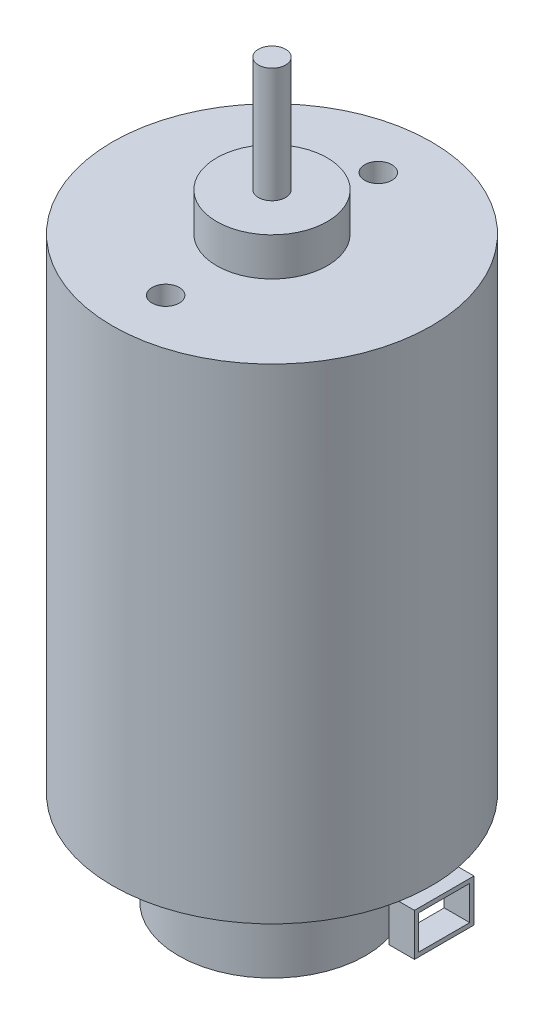
ISO-10303-21;
HEADER;
FILE_DESCRIPTION(('STEP AP214'),'2;1');
FILE_NAME('part.step','',(''),(''),'','','');
FILE_SCHEMA(('AUTOMOTIVE_DESIGN { 1 0 10303 214 1 1 1 1 }'));
ENDSEC;
DATA;
#1=APPLICATION_CONTEXT('core data for automotive mechanical design processes');
#2=APPLICATION_PROTOCOL_DEFINITION('international standard','automotive_design',2000,#1);
#3=PRODUCT_CONTEXT('',#1,'mechanical');
#4=PRODUCT('Part','Part','',(#3));
#5=PRODUCT_RELATED_PRODUCT_CATEGORY('part','',(#4));
#6=PRODUCT_DEFINITION_FORMATION('','',#4);
#7=PRODUCT_DEFINITION_CONTEXT('part definition',#1,'design');
#8=PRODUCT_DEFINITION('design','',#6,#7);
#9=PRODUCT_DEFINITION_SHAPE('','',#8);
#10=(LENGTH_UNIT() NAMED_UNIT(*) SI_UNIT(.MILLI.,.METRE.));
#11=(NAMED_UNIT(*) PLANE_ANGLE_UNIT() SI_UNIT($,.RADIAN.));
#12=(NAMED_UNIT(*) SI_UNIT($,.STERADIAN.) SOLID_ANGLE_UNIT());
#13=UNCERTAINTY_MEASURE_WITH_UNIT(LENGTH_MEASURE(1.E-05),#10,'distance_accuracy_value','');
#14=(GEOMETRIC_REPRESENTATION_CONTEXT(3) GLOBAL_UNCERTAINTY_ASSIGNED_CONTEXT((#13)) GLOBAL_UNIT_ASSIGNED_CONTEXT((#10,
#11,#12)) REPRESENTATION_CONTEXT('',''));
#15=CARTESIAN_POINT('',(0.,0.,0.));
#16=DIRECTION('',(0.,0.,1.));
#17=DIRECTION('',(1.,0.,0.));
#18=AXIS2_PLACEMENT_3D('',#15,#16,#17);
#19=CARTESIAN_POINT('',(0.,0.,0.));
#20=DIRECTION('',(0.,1.,0.));
#21=DIRECTION('',(0.,0.,1.));
#22=AXIS2_PLACEMENT_3D('',#19,#20,#21);
#23=PLANE('',#22);
#24=CARTESIAN_POINT('',(0.,0.,0.));
#25=DIRECTION('',(0.,1.,0.));
#26=DIRECTION('',(0.,0.,1.));
#27=AXIS2_PLACEMENT_3D('',#24,#25,#26);
#28=CIRCLE('',#27,11.);
#29=CARTESIAN_POINT('',(0.,0.,11.));
#30=VERTEX_POINT('',#29);
#31=EDGE_CURVE('E44',#30,#30,#28,.F.);
#32=ORIENTED_EDGE('',*,*,#31,.F.);
#33=EDGE_LOOP('',(#32));
#34=FACE_BOUND('',#33,.T.);
#35=DIRECTION('',(-1.,0.,0.));
#36=VECTOR('',#35,1.);
#37=CARTESIAN_POINT('',(0.,0.,3.5));
#38=LINE('',#37,#36);
#39=CARTESIAN_POINT('',(18.4204370197886,0.,3.5));
#40=VERTEX_POINT('',#39);
#41=CARTESIAN_POINT('',(17.25,0.,3.5));
#42=VERTEX_POINT('',#41);
#43=EDGE_CURVE('E11',#40,#42,#38,.T.);
#44=ORIENTED_EDGE('',*,*,#43,.F.);
#45=CARTESIAN_POINT('',(0.,0.,0.));
#46=DIRECTION('',(0.,1.,0.));
#47=DIRECTION('',(0.,0.,1.));
#48=AXIS2_PLACEMENT_3D('',#45,#46,#47);
#49=CIRCLE('',#48,18.75);
#50=CARTESIAN_POINT('',(18.4204370197886,0.,-3.5));
#51=VERTEX_POINT('',#50);
#52=EDGE_CURVE('E184',#51,#40,#49,.T.);
#53=ORIENTED_EDGE('',*,*,#52,.F.);
#54=DIRECTION('',(1.,0.,0.));
#55=VECTOR('',#54,1.);
#56=CARTESIAN_POINT('',(17.25,0.,-3.5));
#57=LINE('',#56,#55);
#58=CARTESIAN_POINT('',(17.25,0.,-3.5));
#59=VERTEX_POINT('',#58);
#60=EDGE_CURVE('E152',#59,#51,#57,.T.);
#61=ORIENTED_EDGE('',*,*,#60,.F.);
#62=DIRECTION('',(0.,0.,-1.));
#63=VECTOR('',#62,1.);
#64=CARTESIAN_POINT('',(17.25,0.,-3.5));
#65=LINE('',#64,#63);
#66=EDGE_CURVE('E164',#42,#59,#65,.T.);
#67=ORIENTED_EDGE('',*,*,#66,.F.);
#68=EDGE_LOOP('',(#44,#53,#61,#67));
#69=FACE_BOUND('',#68,.T.);
#70=ADVANCED_FACE('F36',(#34,#69),#23,.F.);
#71=CARTESIAN_POINT('',(0.,57.,0.));
#72=DIRECTION('',(0.,-1.,0.));
#73=DIRECTION('',(0.,0.,-1.));
#74=AXIS2_PLACEMENT_3D('',#71,#72,#73);
#75=CYLINDRICAL_SURFACE('',#74,18.75);
#76=CARTESIAN_POINT('',(0.,57.,0.));
#77=DIRECTION('',(0.,1.,0.));
#78=DIRECTION('',(0.,0.,1.));
#79=AXIS2_PLACEMENT_3D('',#76,#77,#78);
#80=CIRCLE('',#79,18.75);
#81=CARTESIAN_POINT('',(0.,57.,18.75));
#82=VERTEX_POINT('',#81);
#83=EDGE_CURVE('E185',#82,#82,#80,.T.);
#84=ORIENTED_EDGE('',*,*,#83,.F.);
#85=EDGE_LOOP('',(#84));
#86=FACE_BOUND('',#85,.T.);
#87=EDGE_CURVE('E188',#40,#51,#49,.T.);
#88=ORIENTED_EDGE('',*,*,#87,.T.);
#89=ORIENTED_EDGE('',*,*,#52,.T.);
#90=EDGE_LOOP('',(#88,#89));
#91=FACE_BOUND('',#90,.T.);
#92=ADVANCED_FACE('F38',(#86,#91),#75,.T.);
#93=CARTESIAN_POINT('',(0.,57.,0.));
#94=DIRECTION('',(0.,1.,0.));
#95=DIRECTION('',(0.,0.,1.));
#96=AXIS2_PLACEMENT_3D('',#93,#94,#95);
#97=PLANE('',#96);
#98=CARTESIAN_POINT('',(0.,57.,-12.5));
#99=DIRECTION('',(0.,1.,0.));
#100=DIRECTION('',(0.,0.,1.));
#101=AXIS2_PLACEMENT_3D('',#98,#99,#100);
#102=CIRCLE('',#101,1.6);
#103=CARTESIAN_POINT('',(0.,57.,-10.9));
#104=VERTEX_POINT('',#103);
#105=EDGE_CURVE('E254',#104,#104,#102,.T.);
#106=ORIENTED_EDGE('',*,*,#105,.F.);
#107=EDGE_LOOP('',(#106));
#108=FACE_BOUND('',#107,.T.);
#109=CARTESIAN_POINT('',(0.,57.,12.5));
#110=DIRECTION('',(0.,1.,0.));
#111=DIRECTION('',(0.,0.,1.));
#112=AXIS2_PLACEMENT_3D('',#109,#110,#111);
#113=CIRCLE('',#112,1.6);
#114=CARTESIAN_POINT('',(0.,57.,14.1));
#115=VERTEX_POINT('',#114);
#116=EDGE_CURVE('E258',#115,#115,#113,.T.);
#117=ORIENTED_EDGE('',*,*,#116,.F.);
#118=EDGE_LOOP('',(#117));
#119=FACE_BOUND('',#118,.T.);
#120=CARTESIAN_POINT('',(0.,57.,0.));
#121=DIRECTION('',(0.,1.,0.));
#122=DIRECTION('',(0.,0.,1.));
#123=AXIS2_PLACEMENT_3D('',#120,#121,#122);
#124=CIRCLE('',#123,6.5);
#125=CARTESIAN_POINT('',(0.,57.,6.5));
#126=VERTEX_POINT('',#125);
#127=EDGE_CURVE('E131',#126,#126,#124,.T.);
#128=ORIENTED_EDGE('',*,*,#127,.F.);
#129=EDGE_LOOP('',(#128));
#130=FACE_BOUND('',#129,.T.);
#131=ORIENTED_EDGE('',*,*,#83,.T.);
#132=EDGE_LOOP('',(#131));
#133=FACE_BOUND('',#132,.T.);
#134=ADVANCED_FACE('F243',(#108,#119,#130,#133),#97,.T.);
#135=CARTESIAN_POINT('',(0.,-11.,0.));
#136=DIRECTION('',(0.,1.,0.));
#137=DIRECTION('',(0.,0.,1.));
#138=AXIS2_PLACEMENT_3D('',#135,#136,#137);
#139=CYLINDRICAL_SURFACE('',#138,11.);
#140=CARTESIAN_POINT('',(0.,-11.,0.));
#141=DIRECTION('',(0.,-1.,0.));
#142=DIRECTION('',(0.,0.,-1.));
#143=AXIS2_PLACEMENT_3D('',#140,#141,#142);
#144=CIRCLE('',#143,11.);
#145=CARTESIAN_POINT('',(0.,-11.,-11.));
#146=VERTEX_POINT('',#145);
#147=EDGE_CURVE('E181',#146,#146,#144,.T.);
#148=ORIENTED_EDGE('',*,*,#147,.F.);
#149=EDGE_LOOP('',(#148));
#150=FACE_BOUND('',#149,.T.);
#151=ORIENTED_EDGE('',*,*,#31,.T.);
#152=EDGE_LOOP('',(#151));
#153=FACE_BOUND('',#152,.T.);
#154=ADVANCED_FACE('F192',(#150,#153),#139,.T.);
#155=CARTESIAN_POINT('',(0.,-11.,0.));
#156=DIRECTION('',(0.,-1.,0.));
#157=DIRECTION('',(0.,0.,-1.));
#158=AXIS2_PLACEMENT_3D('',#155,#156,#157);
#159=PLANE('',#158);
#160=ORIENTED_EDGE('',*,*,#147,.T.);
#161=EDGE_LOOP('',(#160));
#162=FACE_BOUND('',#161,.T.);
#163=ADVANCED_FACE('F236',(#162),#159,.T.);
#164=CARTESIAN_POINT('',(20.25,-5.,-3.5));
#165=DIRECTION('',(-1.,0.,0.));
#166=DIRECTION('',(0.,0.,1.));
#167=AXIS2_PLACEMENT_3D('',#164,#165,#166);
#168=PLANE('',#167);
#169=DIRECTION('',(0.,0.,-1.));
#170=VECTOR('',#169,1.);
#171=CARTESIAN_POINT('',(20.25,-4.5,-3.));
#172=LINE('',#171,#170);
#173=CARTESIAN_POINT('',(20.25,-4.5,3.));
#174=VERTEX_POINT('',#173);
#175=CARTESIAN_POINT('',(20.25,-4.5,-3.));
#176=VERTEX_POINT('',#175);
#177=EDGE_CURVE('E137',#174,#176,#172,.T.);
#178=ORIENTED_EDGE('',*,*,#177,.F.);
#179=DIRECTION('',(0.,-1.,0.));
#180=VECTOR('',#179,1.);
#181=CARTESIAN_POINT('',(20.25,-4.5,3.));
#182=LINE('',#181,#180);
#183=CARTESIAN_POINT('',(20.25,-0.5,3.));
#184=VERTEX_POINT('',#183);
#185=EDGE_CURVE('E51',#184,#174,#182,.T.);
#186=ORIENTED_EDGE('',*,*,#185,.F.);
#187=DIRECTION('',(0.,0.,1.));
#188=VECTOR('',#187,1.);
#189=CARTESIAN_POINT('',(20.25,-0.499999999999999,-3.));
#190=LINE('',#189,#188);
#191=CARTESIAN_POINT('',(20.25,-0.499999999999999,-3.));
#192=VERTEX_POINT('',#191);
#193=EDGE_CURVE('E125',#192,#184,#190,.T.);
#194=ORIENTED_EDGE('',*,*,#193,.F.);
#195=DIRECTION('',(0.,1.,0.));
#196=VECTOR('',#195,1.);
#197=CARTESIAN_POINT('',(20.25,-4.5,-3.));
#198=LINE('',#197,#196);
#199=EDGE_CURVE('E128',#176,#192,#198,.T.);
#200=ORIENTED_EDGE('',*,*,#199,.F.);
#201=EDGE_LOOP('',(#178,#186,#194,#200));
#202=FACE_BOUND('',#201,.T.);
#203=DIRECTION('',(0.,0.,1.));
#204=VECTOR('',#203,1.);
#205=CARTESIAN_POINT('',(20.25,0.,-3.5));
#206=LINE('',#205,#204);
#207=CARTESIAN_POINT('',(20.25,0.,-3.5));
#208=VERTEX_POINT('',#207);
#209=CARTESIAN_POINT('',(20.25,0.,3.5));
#210=VERTEX_POINT('',#209);
#211=EDGE_CURVE('E144',#208,#210,#206,.T.);
#212=ORIENTED_EDGE('',*,*,#211,.T.);
#213=DIRECTION('',(0.,1.,0.));
#214=VECTOR('',#213,1.);
#215=CARTESIAN_POINT('',(20.25,-5.,3.5));
#216=LINE('',#215,#214);
#217=CARTESIAN_POINT('',(20.25,-5.,3.5));
#218=VERTEX_POINT('',#217);
#219=EDGE_CURVE('E178',#218,#210,#216,.T.);
#220=ORIENTED_EDGE('',*,*,#219,.F.);
#221=DIRECTION('',(0.,0.,1.));
#222=VECTOR('',#221,1.);
#223=CARTESIAN_POINT('',(20.25,-5.,-3.5));
#224=LINE('',#223,#222);
#225=CARTESIAN_POINT('',(20.25,-5.,-3.5));
#226=VERTEX_POINT('',#225);
#227=EDGE_CURVE('E148',#226,#218,#224,.T.);
#228=ORIENTED_EDGE('',*,*,#227,.F.);
#229=DIRECTION('',(0.,1.,0.));
#230=VECTOR('',#229,1.);
#231=CARTESIAN_POINT('',(20.25,-5.,-3.5));
#232=LINE('',#231,#230);
#233=EDGE_CURVE('E158',#226,#208,#232,.T.);
#234=ORIENTED_EDGE('',*,*,#233,.T.);
#235=EDGE_LOOP('',(#212,#220,#228,#234));
#236=FACE_BOUND('',#235,.T.);
#237=ADVANCED_FACE('F210',(#202,#236),#168,.F.);
#238=CARTESIAN_POINT('',(17.25,-5.,3.5));
#239=DIRECTION('',(0.,0.,-1.));
#240=DIRECTION('',(-1.,0.,0.));
#241=AXIS2_PLACEMENT_3D('',#238,#239,#240);
#242=PLANE('',#241);
#243=DIRECTION('',(-1.,0.,0.));
#244=VECTOR('',#243,1.);
#245=CARTESIAN_POINT('',(17.25,0.,3.5));
#246=LINE('',#245,#244);
#247=EDGE_CURVE('E161',#210,#40,#246,.T.);
#248=ORIENTED_EDGE('',*,*,#247,.T.);
#249=ORIENTED_EDGE('',*,*,#43,.T.);
#250=DIRECTION('',(0.,1.,0.));
#251=VECTOR('',#250,1.);
#252=CARTESIAN_POINT('',(17.25,-5.,3.5));
#253=LINE('',#252,#251);
#254=CARTESIAN_POINT('',(17.25,-5.,3.5));
#255=VERTEX_POINT('',#254);
#256=EDGE_CURVE('E175',#255,#42,#253,.T.);
#257=ORIENTED_EDGE('',*,*,#256,.F.);
#258=DIRECTION('',(-1.,0.,0.));
#259=VECTOR('',#258,1.);
#260=CARTESIAN_POINT('',(17.25,-5.,3.5));
#261=LINE('',#260,#259);
#262=EDGE_CURVE('E151',#218,#255,#261,.T.);
#263=ORIENTED_EDGE('',*,*,#262,.F.);
#264=ORIENTED_EDGE('',*,*,#219,.T.);
#265=EDGE_LOOP('',(#248,#249,#257,#263,#264));
#266=FACE_BOUND('',#265,.T.);
#267=ADVANCED_FACE('F206',(#266),#242,.F.);
#268=CARTESIAN_POINT('',(17.25,-5.,-3.5));
#269=DIRECTION('',(1.,0.,0.));
#270=DIRECTION('',(0.,0.,-1.));
#271=AXIS2_PLACEMENT_3D('',#268,#269,#270);
#272=PLANE('',#271);
#273=DIRECTION('',(0.,0.,1.));
#274=VECTOR('',#273,1.);
#275=CARTESIAN_POINT('',(17.25,-0.499999999999999,-3.));
#276=LINE('',#275,#274);
#277=CARTESIAN_POINT('',(17.25,-0.499999999999999,-3.));
#278=VERTEX_POINT('',#277);
#279=CARTESIAN_POINT('',(17.25,-0.5,3.));
#280=VERTEX_POINT('',#279);
#281=EDGE_CURVE('E115',#278,#280,#276,.T.);
#282=ORIENTED_EDGE('',*,*,#281,.T.);
#283=DIRECTION('',(0.,-1.,0.));
#284=VECTOR('',#283,1.);
#285=CARTESIAN_POINT('',(17.25,-4.5,3.));
#286=LINE('',#285,#284);
#287=CARTESIAN_POINT('',(17.25,-4.5,3.));
#288=VERTEX_POINT('',#287);
#289=EDGE_CURVE('E109',#280,#288,#286,.T.);
#290=ORIENTED_EDGE('',*,*,#289,.T.);
#291=DIRECTION('',(0.,0.,-1.));
#292=VECTOR('',#291,1.);
#293=CARTESIAN_POINT('',(17.25,-4.5,-3.));
#294=LINE('',#293,#292);
#295=CARTESIAN_POINT('',(17.25,-4.5,-3.));
#296=VERTEX_POINT('',#295);
#297=EDGE_CURVE('E118',#288,#296,#294,.T.);
#298=ORIENTED_EDGE('',*,*,#297,.T.);
#299=DIRECTION('',(0.,1.,0.));
#300=VECTOR('',#299,1.);
#301=CARTESIAN_POINT('',(17.25,-4.5,-3.));
#302=LINE('',#301,#300);
#303=EDGE_CURVE('E59',#296,#278,#302,.T.);
#304=ORIENTED_EDGE('',*,*,#303,.T.);
#305=EDGE_LOOP('',(#282,#290,#298,#304));
#306=FACE_BOUND('',#305,.T.);
#307=ORIENTED_EDGE('',*,*,#66,.T.);
#308=DIRECTION('',(0.,1.,0.));
#309=VECTOR('',#308,1.);
#310=CARTESIAN_POINT('',(17.25,-5.,-3.5));
#311=LINE('',#310,#309);
#312=CARTESIAN_POINT('',(17.25,-5.,-3.5));
#313=VERTEX_POINT('',#312);
#314=EDGE_CURVE('E172',#313,#59,#311,.T.);
#315=ORIENTED_EDGE('',*,*,#314,.F.);
#316=DIRECTION('',(0.,0.,-1.));
#317=VECTOR('',#316,1.);
#318=CARTESIAN_POINT('',(17.25,-5.,-3.5));
#319=LINE('',#318,#317);
#320=EDGE_CURVE('E154',#255,#313,#319,.T.);
#321=ORIENTED_EDGE('',*,*,#320,.F.);
#322=ORIENTED_EDGE('',*,*,#256,.T.);
#323=EDGE_LOOP('',(#307,#315,#321,#322));
#324=FACE_BOUND('',#323,.T.);
#325=ADVANCED_FACE('F122',(#306,#324),#272,.F.);
#326=CARTESIAN_POINT('',(17.25,-5.,-3.5));
#327=DIRECTION('',(0.,0.,1.));
#328=DIRECTION('',(1.,0.,0.));
#329=AXIS2_PLACEMENT_3D('',#326,#327,#328);
#330=PLANE('',#329);
#331=ORIENTED_EDGE('',*,*,#60,.T.);
#332=EDGE_CURVE('E167',#51,#208,#57,.T.);
#333=ORIENTED_EDGE('',*,*,#332,.T.);
#334=ORIENTED_EDGE('',*,*,#233,.F.);
#335=DIRECTION('',(1.,0.,0.));
#336=VECTOR('',#335,1.);
#337=CARTESIAN_POINT('',(17.25,-5.,-3.5));
#338=LINE('',#337,#336);
#339=EDGE_CURVE('E156',#313,#226,#338,.T.);
#340=ORIENTED_EDGE('',*,*,#339,.F.);
#341=ORIENTED_EDGE('',*,*,#314,.T.);
#342=EDGE_LOOP('',(#331,#333,#334,#340,#341));
#343=FACE_BOUND('',#342,.T.);
#344=ADVANCED_FACE('F214',(#343),#330,.F.);
#345=CARTESIAN_POINT('',(0.,-5.,0.));
#346=DIRECTION('',(0.,1.,0.));
#347=DIRECTION('',(0.,0.,1.));
#348=AXIS2_PLACEMENT_3D('',#345,#346,#347);
#349=PLANE('',#348);
#350=ORIENTED_EDGE('',*,*,#227,.T.);
#351=ORIENTED_EDGE('',*,*,#262,.T.);
#352=ORIENTED_EDGE('',*,*,#320,.T.);
#353=ORIENTED_EDGE('',*,*,#339,.T.);
#354=EDGE_LOOP('',(#350,#351,#352,#353));
#355=FACE_BOUND('',#354,.T.);
#356=ADVANCED_FACE('F218',(#355),#349,.F.);
#357=CARTESIAN_POINT('',(0.,0.,0.));
#358=DIRECTION('',(0.,1.,0.));
#359=DIRECTION('',(0.,0.,1.));
#360=AXIS2_PLACEMENT_3D('',#357,#358,#359);
#361=PLANE('',#360);
#362=ORIENTED_EDGE('',*,*,#87,.F.);
#363=ORIENTED_EDGE('',*,*,#247,.F.);
#364=ORIENTED_EDGE('',*,*,#211,.F.);
#365=ORIENTED_EDGE('',*,*,#332,.F.);
#366=EDGE_LOOP('',(#362,#363,#364,#365));
#367=FACE_BOUND('',#366,.T.);
#368=ADVANCED_FACE('F204',(#367),#361,.T.);
#369=CARTESIAN_POINT('',(17.25,-4.5,3.));
#370=DIRECTION('',(0.,0.,1.));
#371=DIRECTION('',(1.,0.,0.));
#372=AXIS2_PLACEMENT_3D('',#369,#370,#371);
#373=PLANE('',#372);
#374=ORIENTED_EDGE('',*,*,#185,.T.);
#375=DIRECTION('',(1.,0.,0.));
#376=VECTOR('',#375,1.);
#377=CARTESIAN_POINT('',(17.25,-4.5,3.));
#378=LINE('',#377,#376);
#379=EDGE_CURVE('E105',#288,#174,#378,.T.);
#380=ORIENTED_EDGE('',*,*,#379,.F.);
#381=ORIENTED_EDGE('',*,*,#289,.F.);
#382=DIRECTION('',(1.,0.,0.));
#383=VECTOR('',#382,1.);
#384=CARTESIAN_POINT('',(17.25,-0.5,3.));
#385=LINE('',#384,#383);
#386=EDGE_CURVE('E142',#280,#184,#385,.T.);
#387=ORIENTED_EDGE('',*,*,#386,.T.);
#388=EDGE_LOOP('',(#374,#380,#381,#387));
#389=FACE_BOUND('',#388,.T.);
#390=ADVANCED_FACE('F107',(#389),#373,.F.);
#391=CARTESIAN_POINT('',(17.25,-0.499999999999999,-3.));
#392=DIRECTION('',(0.,1.,0.));
#393=DIRECTION('',(0.,0.,1.));
#394=AXIS2_PLACEMENT_3D('',#391,#392,#393);
#395=PLANE('',#394);
#396=ORIENTED_EDGE('',*,*,#193,.T.);
#397=ORIENTED_EDGE('',*,*,#386,.F.);
#398=ORIENTED_EDGE('',*,*,#281,.F.);
#399=DIRECTION('',(1.,0.,0.));
#400=VECTOR('',#399,1.);
#401=CARTESIAN_POINT('',(17.25,-0.499999999999999,-3.));
#402=LINE('',#401,#400);
#403=EDGE_CURVE('E145',#278,#192,#402,.T.);
#404=ORIENTED_EDGE('',*,*,#403,.T.);
#405=EDGE_LOOP('',(#396,#397,#398,#404));
#406=FACE_BOUND('',#405,.T.);
#407=ADVANCED_FACE('F308',(#406),#395,.F.);
#408=CARTESIAN_POINT('',(17.25,-4.5,-3.));
#409=DIRECTION('',(0.,0.,-1.));
#410=DIRECTION('',(-1.,0.,0.));
#411=AXIS2_PLACEMENT_3D('',#408,#409,#410);
#412=PLANE('',#411);
#413=ORIENTED_EDGE('',*,*,#199,.T.);
#414=ORIENTED_EDGE('',*,*,#403,.F.);
#415=ORIENTED_EDGE('',*,*,#303,.F.);
#416=DIRECTION('',(1.,0.,0.));
#417=VECTOR('',#416,1.);
#418=CARTESIAN_POINT('',(17.25,-4.5,-3.));
#419=LINE('',#418,#417);
#420=EDGE_CURVE('E114',#296,#176,#419,.T.);
#421=ORIENTED_EDGE('',*,*,#420,.T.);
#422=EDGE_LOOP('',(#413,#414,#415,#421));
#423=FACE_BOUND('',#422,.T.);
#424=ADVANCED_FACE('F305',(#423),#412,.F.);
#425=CARTESIAN_POINT('',(17.25,-4.5,-3.));
#426=DIRECTION('',(0.,-1.,0.));
#427=DIRECTION('',(0.,0.,-1.));
#428=AXIS2_PLACEMENT_3D('',#425,#426,#427);
#429=PLANE('',#428);
#430=ORIENTED_EDGE('',*,*,#177,.T.);
#431=ORIENTED_EDGE('',*,*,#420,.F.);
#432=ORIENTED_EDGE('',*,*,#297,.F.);
#433=ORIENTED_EDGE('',*,*,#379,.T.);
#434=EDGE_LOOP('',(#430,#431,#432,#433));
#435=FACE_BOUND('',#434,.T.);
#436=ADVANCED_FACE('F119',(#435),#429,.F.);
#437=CARTESIAN_POINT('',(0.,61.5,0.));
#438=DIRECTION('',(0.,-1.,0.));
#439=DIRECTION('',(0.,0.,-1.));
#440=AXIS2_PLACEMENT_3D('',#437,#438,#439);
#441=CYLINDRICAL_SURFACE('',#440,6.5);
#442=CARTESIAN_POINT('',(0.,61.5,0.));
#443=DIRECTION('',(0.,1.,0.));
#444=DIRECTION('',(0.,0.,1.));
#445=AXIS2_PLACEMENT_3D('',#442,#443,#444);
#446=CIRCLE('',#445,6.5);
#447=CARTESIAN_POINT('',(0.,61.5,6.5));
#448=VERTEX_POINT('',#447);
#449=EDGE_CURVE('E138',#448,#448,#446,.T.);
#450=ORIENTED_EDGE('',*,*,#449,.F.);
#451=EDGE_LOOP('',(#450));
#452=FACE_BOUND('',#451,.T.);
#453=ORIENTED_EDGE('',*,*,#127,.T.);
#454=EDGE_LOOP('',(#453));
#455=FACE_BOUND('',#454,.T.);
#456=ADVANCED_FACE('F296',(#452,#455),#441,.T.);
#457=CARTESIAN_POINT('',(0.,61.5,0.));
#458=DIRECTION('',(0.,1.,0.));
#459=DIRECTION('',(0.,0.,1.));
#460=AXIS2_PLACEMENT_3D('',#457,#458,#459);
#461=PLANE('',#460);
#462=CARTESIAN_POINT('',(0.,61.5,0.));
#463=DIRECTION('',(0.,1.,0.));
#464=DIRECTION('',(0.,0.,1.));
#465=AXIS2_PLACEMENT_3D('',#462,#463,#464);
#466=CIRCLE('',#465,1.6);
#467=CARTESIAN_POINT('',(0.,61.5,1.6));
#468=VERTEX_POINT('',#467);
#469=EDGE_CURVE('E277',#468,#468,#466,.T.);
#470=ORIENTED_EDGE('',*,*,#469,.F.);
#471=EDGE_LOOP('',(#470));
#472=FACE_BOUND('',#471,.T.);
#473=ORIENTED_EDGE('',*,*,#449,.T.);
#474=EDGE_LOOP('',(#473));
#475=FACE_BOUND('',#474,.T.);
#476=ADVANCED_FACE('F292',(#472,#475),#461,.T.);
#477=CARTESIAN_POINT('',(0.,53.,12.5));
#478=DIRECTION('',(0.,1.,0.));
#479=DIRECTION('',(0.,0.,1.));
#480=AXIS2_PLACEMENT_3D('',#477,#478,#479);
#481=CYLINDRICAL_SURFACE('',#480,1.6);
#482=CARTESIAN_POINT('',(0.,53.,12.5));
#483=DIRECTION('',(0.,1.,0.));
#484=DIRECTION('',(0.,0.,1.));
#485=AXIS2_PLACEMENT_3D('',#482,#483,#484);
#486=CIRCLE('',#485,1.6);
#487=CARTESIAN_POINT('',(0.,53.,14.1));
#488=VERTEX_POINT('',#487);
#489=EDGE_CURVE('E264',#488,#488,#486,.T.);
#490=ORIENTED_EDGE('',*,*,#489,.F.);
#491=EDGE_LOOP('',(#490));
#492=FACE_BOUND('',#491,.T.);
#493=ORIENTED_EDGE('',*,*,#116,.T.);
#494=EDGE_LOOP('',(#493));
#495=FACE_BOUND('',#494,.T.);
#496=ADVANCED_FACE('F295',(#492,#495),#481,.F.);
#497=CARTESIAN_POINT('',(0.,53.,12.5));
#498=DIRECTION('',(0.,1.,0.));
#499=DIRECTION('',(0.,0.,1.));
#500=AXIS2_PLACEMENT_3D('',#497,#498,#499);
#501=PLANE('',#500);
#502=ORIENTED_EDGE('',*,*,#489,.T.);
#503=EDGE_LOOP('',(#502));
#504=FACE_BOUND('',#503,.T.);
#505=ADVANCED_FACE('F344',(#504),#501,.T.);
#506=CARTESIAN_POINT('',(0.,53.,-12.5));
#507=DIRECTION('',(0.,1.,0.));
#508=DIRECTION('',(0.,0.,1.));
#509=AXIS2_PLACEMENT_3D('',#506,#507,#508);
#510=CYLINDRICAL_SURFACE('',#509,1.6);
#511=CARTESIAN_POINT('',(0.,53.,-12.5));
#512=DIRECTION('',(0.,1.,0.));
#513=DIRECTION('',(0.,0.,1.));
#514=AXIS2_PLACEMENT_3D('',#511,#512,#513);
#515=CIRCLE('',#514,1.6);
#516=CARTESIAN_POINT('',(0.,53.,-10.9));
#517=VERTEX_POINT('',#516);
#518=EDGE_CURVE('E270',#517,#517,#515,.T.);
#519=ORIENTED_EDGE('',*,*,#518,.F.);
#520=EDGE_LOOP('',(#519));
#521=FACE_BOUND('',#520,.T.);
#522=ORIENTED_EDGE('',*,*,#105,.T.);
#523=EDGE_LOOP('',(#522));
#524=FACE_BOUND('',#523,.T.);
#525=ADVANCED_FACE('F353',(#521,#524),#510,.F.);
#526=CARTESIAN_POINT('',(0.,53.,-12.5));
#527=DIRECTION('',(0.,1.,0.));
#528=DIRECTION('',(0.,0.,1.));
#529=AXIS2_PLACEMENT_3D('',#526,#527,#528);
#530=PLANE('',#529);
#531=ORIENTED_EDGE('',*,*,#518,.T.);
#532=EDGE_LOOP('',(#531));
#533=FACE_BOUND('',#532,.T.);
#534=ADVANCED_FACE('F288',(#533),#530,.T.);
#535=CARTESIAN_POINT('',(0.,75.,0.));
#536=DIRECTION('',(0.,-1.,0.));
#537=DIRECTION('',(0.,0.,-1.));
#538=AXIS2_PLACEMENT_3D('',#535,#536,#537);
#539=CYLINDRICAL_SURFACE('',#538,1.6);
#540=CARTESIAN_POINT('',(0.,75.,0.));
#541=DIRECTION('',(0.,1.,0.));
#542=DIRECTION('',(0.,0.,1.));
#543=AXIS2_PLACEMENT_3D('',#540,#541,#542);
#544=CIRCLE('',#543,1.6);
#545=CARTESIAN_POINT('',(0.,75.,1.6));
#546=VERTEX_POINT('',#545);
#547=EDGE_CURVE('E274',#546,#546,#544,.T.);
#548=ORIENTED_EDGE('',*,*,#547,.F.);
#549=EDGE_LOOP('',(#548));
#550=FACE_BOUND('',#549,.T.);
#551=ORIENTED_EDGE('',*,*,#469,.T.);
#552=EDGE_LOOP('',(#551));
#553=FACE_BOUND('',#552,.T.);
#554=ADVANCED_FACE('F285',(#550,#553),#539,.T.);
#555=CARTESIAN_POINT('',(0.,75.,0.));
#556=DIRECTION('',(0.,1.,0.));
#557=DIRECTION('',(0.,0.,1.));
#558=AXIS2_PLACEMENT_3D('',#555,#556,#557);
#559=PLANE('',#558);
#560=ORIENTED_EDGE('',*,*,#547,.T.);
#561=EDGE_LOOP('',(#560));
#562=FACE_BOUND('',#561,.T.);
#563=ADVANCED_FACE('F283',(#562),#559,.T.);
#564=CLOSED_SHELL('',(#70,#92,#134,#154,#163,#237,#267,#325,#344,#356,#368,#390,#407,#424,#436,
#456,#476,#496,#505,#525,#534,#554,#563));
#565=MANIFOLD_SOLID_BREP('B2',#564);
#566=ADVANCED_BREP_SHAPE_REPRESENTATION('',(#18,#565),#14);
#567=SHAPE_DEFINITION_REPRESENTATION(#9,#566);
ENDSEC;
END-ISO-10303-21;
